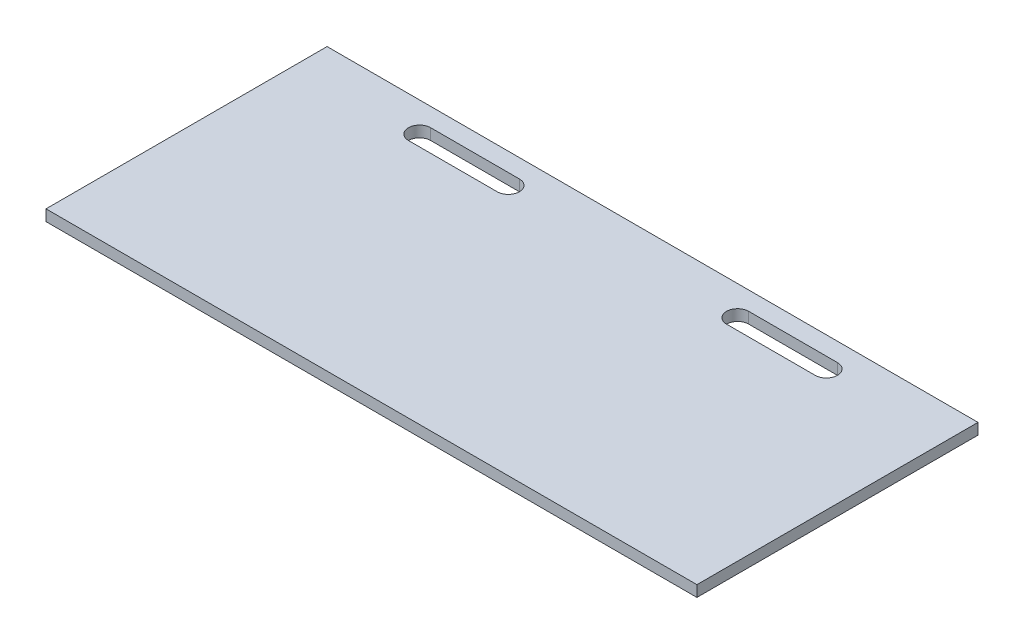
ISO-10303-21;
HEADER;
FILE_DESCRIPTION(('STEP AP214'),'2;1');
FILE_NAME('part.step','',(''),(''),'','','');
FILE_SCHEMA(('AUTOMOTIVE_DESIGN { 1 0 10303 214 1 1 1 1 }'));
ENDSEC;
DATA;
#1=APPLICATION_CONTEXT('core data for automotive mechanical design processes');
#2=APPLICATION_PROTOCOL_DEFINITION('international standard','automotive_design',2000,#1);
#3=PRODUCT_CONTEXT('',#1,'mechanical');
#4=PRODUCT('Part','Part','',(#3));
#5=PRODUCT_RELATED_PRODUCT_CATEGORY('part','',(#4));
#6=PRODUCT_DEFINITION_FORMATION('','',#4);
#7=PRODUCT_DEFINITION_CONTEXT('part definition',#1,'design');
#8=PRODUCT_DEFINITION('design','',#6,#7);
#9=PRODUCT_DEFINITION_SHAPE('','',#8);
#10=(LENGTH_UNIT() NAMED_UNIT(*) SI_UNIT(.MILLI.,.METRE.));
#11=(NAMED_UNIT(*) PLANE_ANGLE_UNIT() SI_UNIT($,.RADIAN.));
#12=(NAMED_UNIT(*) SI_UNIT($,.STERADIAN.) SOLID_ANGLE_UNIT());
#13=UNCERTAINTY_MEASURE_WITH_UNIT(LENGTH_MEASURE(1.E-05),#10,'distance_accuracy_value','');
#14=(GEOMETRIC_REPRESENTATION_CONTEXT(3) GLOBAL_UNCERTAINTY_ASSIGNED_CONTEXT((#13)) GLOBAL_UNIT_ASSIGNED_CONTEXT((#10,
#11,#12)) REPRESENTATION_CONTEXT('',''));
#15=CARTESIAN_POINT('',(0.,0.,0.));
#16=DIRECTION('',(0.,0.,1.));
#17=DIRECTION('',(1.,0.,0.));
#18=AXIS2_PLACEMENT_3D('',#15,#16,#17);
#19=CARTESIAN_POINT('',(-558.8,9.525,241.3));
#20=DIRECTION('',(-1.,0.,0.));
#21=DIRECTION('',(0.,0.,1.));
#22=AXIS2_PLACEMENT_3D('',#19,#20,#21);
#23=PLANE('',#22);
#24=DIRECTION('',(0.,0.,-1.));
#25=VECTOR('',#24,1.);
#26=CARTESIAN_POINT('',(-558.8,-9.525,241.3));
#27=LINE('',#26,#25);
#28=CARTESIAN_POINT('',(-558.8,-9.525,241.3));
#29=VERTEX_POINT('',#28);
#30=CARTESIAN_POINT('',(-558.8,-9.525,-241.3));
#31=VERTEX_POINT('',#30);
#32=EDGE_CURVE('E187',#29,#31,#27,.T.);
#33=ORIENTED_EDGE('',*,*,#32,.F.);
#34=DIRECTION('',(0.,-1.,0.));
#35=VECTOR('',#34,1.);
#36=CARTESIAN_POINT('',(-558.8,9.525,241.3));
#37=LINE('',#36,#35);
#38=CARTESIAN_POINT('',(-558.8,9.525,241.3));
#39=VERTEX_POINT('',#38);
#40=EDGE_CURVE('E11',#39,#29,#37,.T.);
#41=ORIENTED_EDGE('',*,*,#40,.F.);
#42=DIRECTION('',(0.,0.,-1.));
#43=VECTOR('',#42,1.);
#44=CARTESIAN_POINT('',(-558.8,9.525,241.3));
#45=LINE('',#44,#43);
#46=CARTESIAN_POINT('',(-558.8,9.525,-241.3));
#47=VERTEX_POINT('',#46);
#48=EDGE_CURVE('E234',#39,#47,#45,.T.);
#49=ORIENTED_EDGE('',*,*,#48,.T.);
#50=DIRECTION('',(0.,-1.,0.));
#51=VECTOR('',#50,1.);
#52=CARTESIAN_POINT('',(-558.8,9.525,-241.3));
#53=LINE('',#52,#51);
#54=EDGE_CURVE('E51',#47,#31,#53,.T.);
#55=ORIENTED_EDGE('',*,*,#54,.T.);
#56=EDGE_LOOP('',(#33,#41,#49,#55));
#57=FACE_BOUND('',#56,.T.);
#58=ADVANCED_FACE('F48',(#57),#23,.T.);
#59=CARTESIAN_POINT('',(-558.8,9.525,241.3));
#60=DIRECTION('',(0.,0.,-1.));
#61=DIRECTION('',(-1.,0.,0.));
#62=AXIS2_PLACEMENT_3D('',#59,#60,#61);
#63=PLANE('',#62);
#64=DIRECTION('',(1.,0.,0.));
#65=VECTOR('',#64,1.);
#66=CARTESIAN_POINT('',(-558.8,-9.525,241.3));
#67=LINE('',#66,#65);
#68=CARTESIAN_POINT('',(558.8,-9.525,241.3));
#69=VERTEX_POINT('',#68);
#70=EDGE_CURVE('E239',#29,#69,#67,.T.);
#71=ORIENTED_EDGE('',*,*,#70,.T.);
#72=DIRECTION('',(0.,-1.,0.));
#73=VECTOR('',#72,1.);
#74=CARTESIAN_POINT('',(558.8,9.525,241.3));
#75=LINE('',#74,#73);
#76=CARTESIAN_POINT('',(558.8,9.525,241.3));
#77=VERTEX_POINT('',#76);
#78=EDGE_CURVE('E57',#77,#69,#75,.T.);
#79=ORIENTED_EDGE('',*,*,#78,.F.);
#80=DIRECTION('',(1.,0.,0.));
#81=VECTOR('',#80,1.);
#82=CARTESIAN_POINT('',(-558.8,9.525,241.3));
#83=LINE('',#82,#81);
#84=EDGE_CURVE('E246',#39,#77,#83,.T.);
#85=ORIENTED_EDGE('',*,*,#84,.F.);
#86=ORIENTED_EDGE('',*,*,#40,.T.);
#87=EDGE_LOOP('',(#71,#79,#85,#86));
#88=FACE_BOUND('',#87,.T.);
#89=ADVANCED_FACE('F283',(#88),#63,.F.);
#90=CARTESIAN_POINT('',(558.8,9.525,241.3));
#91=DIRECTION('',(-1.,0.,0.));
#92=DIRECTION('',(0.,0.,1.));
#93=AXIS2_PLACEMENT_3D('',#90,#91,#92);
#94=PLANE('',#93);
#95=DIRECTION('',(0.,0.,-1.));
#96=VECTOR('',#95,1.);
#97=CARTESIAN_POINT('',(558.8,-9.525,241.3));
#98=LINE('',#97,#96);
#99=CARTESIAN_POINT('',(558.8,-9.525,-241.3));
#100=VERTEX_POINT('',#99);
#101=EDGE_CURVE('E256',#69,#100,#98,.T.);
#102=ORIENTED_EDGE('',*,*,#101,.T.);
#103=DIRECTION('',(0.,-1.,0.));
#104=VECTOR('',#103,1.);
#105=CARTESIAN_POINT('',(558.8,9.525,-241.3));
#106=LINE('',#105,#104);
#107=CARTESIAN_POINT('',(558.8,9.525,-241.3));
#108=VERTEX_POINT('',#107);
#109=EDGE_CURVE('E264',#108,#100,#106,.T.);
#110=ORIENTED_EDGE('',*,*,#109,.F.);
#111=DIRECTION('',(0.,0.,-1.));
#112=VECTOR('',#111,1.);
#113=CARTESIAN_POINT('',(558.8,9.525,241.3));
#114=LINE('',#113,#112);
#115=EDGE_CURVE('E243',#77,#108,#114,.T.);
#116=ORIENTED_EDGE('',*,*,#115,.F.);
#117=ORIENTED_EDGE('',*,*,#78,.T.);
#118=EDGE_LOOP('',(#102,#110,#116,#117));
#119=FACE_BOUND('',#118,.T.);
#120=ADVANCED_FACE('F287',(#119),#94,.F.);
#121=CARTESIAN_POINT('',(-558.8,9.525,-241.3));
#122=DIRECTION('',(0.,0.,-1.));
#123=DIRECTION('',(-1.,0.,0.));
#124=AXIS2_PLACEMENT_3D('',#121,#122,#123);
#125=PLANE('',#124);
#126=DIRECTION('',(1.,0.,0.));
#127=VECTOR('',#126,1.);
#128=CARTESIAN_POINT('',(-558.8,-9.525,-241.3));
#129=LINE('',#128,#127);
#130=EDGE_CURVE('E252',#31,#100,#129,.T.);
#131=ORIENTED_EDGE('',*,*,#130,.F.);
#132=ORIENTED_EDGE('',*,*,#54,.F.);
#133=DIRECTION('',(1.,0.,0.));
#134=VECTOR('',#133,1.);
#135=CARTESIAN_POINT('',(-558.8,9.525,-241.3));
#136=LINE('',#135,#134);
#137=EDGE_CURVE('E238',#47,#108,#136,.T.);
#138=ORIENTED_EDGE('',*,*,#137,.T.);
#139=ORIENTED_EDGE('',*,*,#109,.T.);
#140=EDGE_LOOP('',(#131,#132,#138,#139));
#141=FACE_BOUND('',#140,.T.);
#142=ADVANCED_FACE('F276',(#141),#125,.T.);
#143=CARTESIAN_POINT('',(0.,9.525,0.));
#144=DIRECTION('',(0.,-1.,0.));
#145=DIRECTION('',(0.,0.,-1.));
#146=AXIS2_PLACEMENT_3D('',#143,#144,#145);
#147=PLANE('',#146);
#148=DIRECTION('',(1.,0.,0.));
#149=VECTOR('',#148,1.);
#150=CARTESIAN_POINT('',(-349.25,9.525,-209.55));
#151=LINE('',#150,#149);
#152=CARTESIAN_POINT('',(-349.25,9.525,-209.55));
#153=VERTEX_POINT('',#152);
#154=CARTESIAN_POINT('',(-196.85,9.525,-209.55));
#155=VERTEX_POINT('',#154);
#156=EDGE_CURVE('E151',#153,#155,#151,.T.);
#157=ORIENTED_EDGE('',*,*,#156,.T.);
#158=CARTESIAN_POINT('',(-196.85,9.525,-190.5));
#159=DIRECTION('',(0.,-1.,0.));
#160=DIRECTION('',(0.,0.,1.));
#161=AXIS2_PLACEMENT_3D('',#158,#159,#160);
#162=CIRCLE('',#161,19.05);
#163=CARTESIAN_POINT('',(-196.85,9.525,-171.45));
#164=VERTEX_POINT('',#163);
#165=EDGE_CURVE('E142',#155,#164,#162,.T.);
#166=ORIENTED_EDGE('',*,*,#165,.T.);
#167=DIRECTION('',(-1.,0.,0.));
#168=VECTOR('',#167,1.);
#169=CARTESIAN_POINT('',(-349.25,9.525,-171.45));
#170=LINE('',#169,#168);
#171=CARTESIAN_POINT('',(-349.25,9.525,-171.45));
#172=VERTEX_POINT('',#171);
#173=EDGE_CURVE('E154',#164,#172,#170,.T.);
#174=ORIENTED_EDGE('',*,*,#173,.T.);
#175=CARTESIAN_POINT('',(-349.25,9.525,-190.5));
#176=DIRECTION('',(0.,-1.,0.));
#177=DIRECTION('',(0.,0.,1.));
#178=AXIS2_PLACEMENT_3D('',#175,#176,#177);
#179=CIRCLE('',#178,19.05);
#180=EDGE_CURVE('E65',#172,#153,#179,.T.);
#181=ORIENTED_EDGE('',*,*,#180,.T.);
#182=EDGE_LOOP('',(#157,#166,#174,#181));
#183=FACE_BOUND('',#182,.T.);
#184=DIRECTION('',(1.,0.,0.));
#185=VECTOR('',#184,1.);
#186=CARTESIAN_POINT('',(196.85,9.525,-209.55));
#187=LINE('',#186,#185);
#188=CARTESIAN_POINT('',(196.85,9.525,-209.55));
#189=VERTEX_POINT('',#188);
#190=CARTESIAN_POINT('',(349.25,9.525,-209.55));
#191=VERTEX_POINT('',#190);
#192=EDGE_CURVE('E197',#189,#191,#187,.T.);
#193=ORIENTED_EDGE('',*,*,#192,.T.);
#194=CARTESIAN_POINT('',(349.25,9.525,-190.5));
#195=DIRECTION('',(0.,-1.,0.));
#196=DIRECTION('',(0.,0.,1.));
#197=AXIS2_PLACEMENT_3D('',#194,#195,#196);
#198=CIRCLE('',#197,19.05);
#199=CARTESIAN_POINT('',(349.25,9.525,-171.45));
#200=VERTEX_POINT('',#199);
#201=EDGE_CURVE('E212',#191,#200,#198,.T.);
#202=ORIENTED_EDGE('',*,*,#201,.T.);
#203=DIRECTION('',(-1.,0.,0.));
#204=VECTOR('',#203,1.);
#205=CARTESIAN_POINT('',(196.85,9.525,-171.45));
#206=LINE('',#205,#204);
#207=CARTESIAN_POINT('',(196.85,9.525,-171.45));
#208=VERTEX_POINT('',#207);
#209=EDGE_CURVE('E227',#200,#208,#206,.T.);
#210=ORIENTED_EDGE('',*,*,#209,.T.);
#211=CARTESIAN_POINT('',(196.85,9.525,-190.5));
#212=DIRECTION('',(0.,-1.,0.));
#213=DIRECTION('',(0.,0.,-1.));
#214=AXIS2_PLACEMENT_3D('',#211,#212,#213);
#215=CIRCLE('',#214,19.05);
#216=EDGE_CURVE('E73',#208,#189,#215,.T.);
#217=ORIENTED_EDGE('',*,*,#216,.T.);
#218=EDGE_LOOP('',(#193,#202,#210,#217));
#219=FACE_BOUND('',#218,.T.);
#220=ORIENTED_EDGE('',*,*,#48,.F.);
#221=ORIENTED_EDGE('',*,*,#84,.T.);
#222=ORIENTED_EDGE('',*,*,#115,.T.);
#223=ORIENTED_EDGE('',*,*,#137,.F.);
#224=EDGE_LOOP('',(#220,#221,#222,#223));
#225=FACE_BOUND('',#224,.T.);
#226=ADVANCED_FACE('F159',(#183,#219,#225),#147,.F.);
#227=CARTESIAN_POINT('',(0.,-9.525,0.));
#228=DIRECTION('',(0.,-1.,0.));
#229=DIRECTION('',(0.,0.,-1.));
#230=AXIS2_PLACEMENT_3D('',#227,#228,#229);
#231=PLANE('',#230);
#232=CARTESIAN_POINT('',(-196.85,-9.525,-190.5));
#233=DIRECTION('',(0.,-1.,0.));
#234=DIRECTION('',(0.,0.,1.));
#235=AXIS2_PLACEMENT_3D('',#232,#233,#234);
#236=CIRCLE('',#235,19.05);
#237=CARTESIAN_POINT('',(-196.85,-9.525,-209.55));
#238=VERTEX_POINT('',#237);
#239=CARTESIAN_POINT('',(-196.85,-9.525,-171.45));
#240=VERTEX_POINT('',#239);
#241=EDGE_CURVE('E145',#238,#240,#236,.T.);
#242=ORIENTED_EDGE('',*,*,#241,.F.);
#243=DIRECTION('',(1.,0.,0.));
#244=VECTOR('',#243,1.);
#245=CARTESIAN_POINT('',(-349.25,-9.525,-209.55));
#246=LINE('',#245,#244);
#247=CARTESIAN_POINT('',(-349.25,-9.525,-209.55));
#248=VERTEX_POINT('',#247);
#249=EDGE_CURVE('E163',#248,#238,#246,.T.);
#250=ORIENTED_EDGE('',*,*,#249,.F.);
#251=CARTESIAN_POINT('',(-349.25,-9.525,-190.5));
#252=DIRECTION('',(0.,-1.,0.));
#253=DIRECTION('',(0.,0.,1.));
#254=AXIS2_PLACEMENT_3D('',#251,#252,#253);
#255=CIRCLE('',#254,19.05);
#256=CARTESIAN_POINT('',(-349.25,-9.525,-171.45));
#257=VERTEX_POINT('',#256);
#258=EDGE_CURVE('E168',#257,#248,#255,.T.);
#259=ORIENTED_EDGE('',*,*,#258,.F.);
#260=DIRECTION('',(-1.,0.,0.));
#261=VECTOR('',#260,1.);
#262=CARTESIAN_POINT('',(-349.25,-9.525,-171.45));
#263=LINE('',#262,#261);
#264=EDGE_CURVE('E177',#240,#257,#263,.T.);
#265=ORIENTED_EDGE('',*,*,#264,.F.);
#266=EDGE_LOOP('',(#242,#250,#259,#265));
#267=FACE_BOUND('',#266,.T.);
#268=CARTESIAN_POINT('',(349.25,-9.525,-190.5));
#269=DIRECTION('',(0.,-1.,0.));
#270=DIRECTION('',(0.,0.,1.));
#271=AXIS2_PLACEMENT_3D('',#268,#269,#270);
#272=CIRCLE('',#271,19.05);
#273=CARTESIAN_POINT('',(349.25,-9.525,-209.55));
#274=VERTEX_POINT('',#273);
#275=CARTESIAN_POINT('',(349.25,-9.525,-171.45));
#276=VERTEX_POINT('',#275);
#277=EDGE_CURVE('E178',#274,#276,#272,.T.);
#278=ORIENTED_EDGE('',*,*,#277,.F.);
#279=DIRECTION('',(1.,0.,0.));
#280=VECTOR('',#279,1.);
#281=CARTESIAN_POINT('',(196.85,-9.525,-209.55));
#282=LINE('',#281,#280);
#283=CARTESIAN_POINT('',(196.85,-9.525,-209.55));
#284=VERTEX_POINT('',#283);
#285=EDGE_CURVE('E207',#284,#274,#282,.T.);
#286=ORIENTED_EDGE('',*,*,#285,.F.);
#287=CARTESIAN_POINT('',(196.85,-9.525,-190.5));
#288=DIRECTION('',(0.,-1.,0.));
#289=DIRECTION('',(0.,0.,-1.));
#290=AXIS2_PLACEMENT_3D('',#287,#288,#289);
#291=CIRCLE('',#290,19.05);
#292=CARTESIAN_POINT('',(196.85,-9.525,-171.45));
#293=VERTEX_POINT('',#292);
#294=EDGE_CURVE('E211',#293,#284,#291,.T.);
#295=ORIENTED_EDGE('',*,*,#294,.F.);
#296=DIRECTION('',(-1.,0.,0.));
#297=VECTOR('',#296,1.);
#298=CARTESIAN_POINT('',(196.85,-9.525,-171.45));
#299=LINE('',#298,#297);
#300=EDGE_CURVE('E216',#276,#293,#299,.T.);
#301=ORIENTED_EDGE('',*,*,#300,.F.);
#302=EDGE_LOOP('',(#278,#286,#295,#301));
#303=FACE_BOUND('',#302,.T.);
#304=ORIENTED_EDGE('',*,*,#32,.T.);
#305=ORIENTED_EDGE('',*,*,#130,.T.);
#306=ORIENTED_EDGE('',*,*,#101,.F.);
#307=ORIENTED_EDGE('',*,*,#70,.F.);
#308=EDGE_LOOP('',(#304,#305,#306,#307));
#309=FACE_BOUND('',#308,.T.);
#310=ADVANCED_FACE('F280',(#267,#303,#309),#231,.T.);
#311=CARTESIAN_POINT('',(349.25,9.525,-190.5));
#312=DIRECTION('',(0.,-1.,0.));
#313=DIRECTION('',(0.,0.,-1.));
#314=AXIS2_PLACEMENT_3D('',#311,#312,#313);
#315=CYLINDRICAL_SURFACE('',#314,19.05);
#316=ORIENTED_EDGE('',*,*,#277,.T.);
#317=DIRECTION('',(0.,-1.,0.));
#318=VECTOR('',#317,1.);
#319=CARTESIAN_POINT('',(349.25,9.525,-171.45));
#320=LINE('',#319,#318);
#321=EDGE_CURVE('E193',#200,#276,#320,.T.);
#322=ORIENTED_EDGE('',*,*,#321,.F.);
#323=ORIENTED_EDGE('',*,*,#201,.F.);
#324=DIRECTION('',(0.,-1.,0.));
#325=VECTOR('',#324,1.);
#326=CARTESIAN_POINT('',(349.25,9.525,-209.55));
#327=LINE('',#326,#325);
#328=EDGE_CURVE('E204',#191,#274,#327,.T.);
#329=ORIENTED_EDGE('',*,*,#328,.T.);
#330=EDGE_LOOP('',(#316,#322,#323,#329));
#331=FACE_BOUND('',#330,.T.);
#332=ADVANCED_FACE('F295',(#331),#315,.F.);
#333=CARTESIAN_POINT('',(196.85,9.525,-209.55));
#334=DIRECTION('',(0.,0.,-1.));
#335=DIRECTION('',(-1.,0.,0.));
#336=AXIS2_PLACEMENT_3D('',#333,#334,#335);
#337=PLANE('',#336);
#338=ORIENTED_EDGE('',*,*,#285,.T.);
#339=ORIENTED_EDGE('',*,*,#328,.F.);
#340=ORIENTED_EDGE('',*,*,#192,.F.);
#341=DIRECTION('',(0.,-1.,0.));
#342=VECTOR('',#341,1.);
#343=CARTESIAN_POINT('',(196.85,9.525,-209.55));
#344=LINE('',#343,#342);
#345=EDGE_CURVE('E201',#189,#284,#344,.T.);
#346=ORIENTED_EDGE('',*,*,#345,.T.);
#347=EDGE_LOOP('',(#338,#339,#340,#346));
#348=FACE_BOUND('',#347,.T.);
#349=ADVANCED_FACE('F335',(#348),#337,.F.);
#350=CARTESIAN_POINT('',(196.85,9.525,-190.5));
#351=DIRECTION('',(0.,-1.,0.));
#352=DIRECTION('',(0.,0.,-1.));
#353=AXIS2_PLACEMENT_3D('',#350,#351,#352);
#354=CYLINDRICAL_SURFACE('',#353,19.05);
#355=ORIENTED_EDGE('',*,*,#294,.T.);
#356=ORIENTED_EDGE('',*,*,#345,.F.);
#357=ORIENTED_EDGE('',*,*,#216,.F.);
#358=DIRECTION('',(0.,-1.,0.));
#359=VECTOR('',#358,1.);
#360=CARTESIAN_POINT('',(196.85,9.525,-171.45));
#361=LINE('',#360,#359);
#362=EDGE_CURVE('E198',#208,#293,#361,.T.);
#363=ORIENTED_EDGE('',*,*,#362,.T.);
#364=EDGE_LOOP('',(#355,#356,#357,#363));
#365=FACE_BOUND('',#364,.T.);
#366=ADVANCED_FACE('F345',(#365),#354,.F.);
#367=CARTESIAN_POINT('',(196.85,9.525,-171.45));
#368=DIRECTION('',(0.,0.,1.));
#369=DIRECTION('',(1.,0.,0.));
#370=AXIS2_PLACEMENT_3D('',#367,#368,#369);
#371=PLANE('',#370);
#372=ORIENTED_EDGE('',*,*,#300,.T.);
#373=ORIENTED_EDGE('',*,*,#362,.F.);
#374=ORIENTED_EDGE('',*,*,#209,.F.);
#375=ORIENTED_EDGE('',*,*,#321,.T.);
#376=EDGE_LOOP('',(#372,#373,#374,#375));
#377=FACE_BOUND('',#376,.T.);
#378=ADVANCED_FACE('F354',(#377),#371,.F.);
#379=CARTESIAN_POINT('',(-196.85,9.525,-190.5));
#380=DIRECTION('',(0.,-1.,0.));
#381=DIRECTION('',(0.,0.,-1.));
#382=AXIS2_PLACEMENT_3D('',#379,#380,#381);
#383=CYLINDRICAL_SURFACE('',#382,19.05);
#384=ORIENTED_EDGE('',*,*,#241,.T.);
#385=DIRECTION('',(0.,-1.,0.));
#386=VECTOR('',#385,1.);
#387=CARTESIAN_POINT('',(-196.85,9.525,-171.45));
#388=LINE('',#387,#386);
#389=EDGE_CURVE('E138',#164,#240,#388,.T.);
#390=ORIENTED_EDGE('',*,*,#389,.F.);
#391=ORIENTED_EDGE('',*,*,#165,.F.);
#392=DIRECTION('',(0.,-1.,0.));
#393=VECTOR('',#392,1.);
#394=CARTESIAN_POINT('',(-196.85,9.525,-209.55));
#395=LINE('',#394,#393);
#396=EDGE_CURVE('E184',#155,#238,#395,.T.);
#397=ORIENTED_EDGE('',*,*,#396,.T.);
#398=EDGE_LOOP('',(#384,#390,#391,#397));
#399=FACE_BOUND('',#398,.T.);
#400=ADVANCED_FACE('F140',(#399),#383,.F.);
#401=CARTESIAN_POINT('',(-349.25,9.525,-209.55));
#402=DIRECTION('',(0.,0.,-1.));
#403=DIRECTION('',(-1.,0.,0.));
#404=AXIS2_PLACEMENT_3D('',#401,#402,#403);
#405=PLANE('',#404);
#406=ORIENTED_EDGE('',*,*,#249,.T.);
#407=ORIENTED_EDGE('',*,*,#396,.F.);
#408=ORIENTED_EDGE('',*,*,#156,.F.);
#409=DIRECTION('',(0.,-1.,0.));
#410=VECTOR('',#409,1.);
#411=CARTESIAN_POINT('',(-349.25,9.525,-209.55));
#412=LINE('',#411,#410);
#413=EDGE_CURVE('E188',#153,#248,#412,.T.);
#414=ORIENTED_EDGE('',*,*,#413,.T.);
#415=EDGE_LOOP('',(#406,#407,#408,#414));
#416=FACE_BOUND('',#415,.T.);
#417=ADVANCED_FACE('F372',(#416),#405,.F.);
#418=CARTESIAN_POINT('',(-349.25,9.525,-190.5));
#419=DIRECTION('',(0.,-1.,0.));
#420=DIRECTION('',(0.,0.,-1.));
#421=AXIS2_PLACEMENT_3D('',#418,#419,#420);
#422=CYLINDRICAL_SURFACE('',#421,19.05);
#423=ORIENTED_EDGE('',*,*,#258,.T.);
#424=ORIENTED_EDGE('',*,*,#413,.F.);
#425=ORIENTED_EDGE('',*,*,#180,.F.);
#426=DIRECTION('',(0.,-1.,0.));
#427=VECTOR('',#426,1.);
#428=CARTESIAN_POINT('',(-349.25,9.525,-171.45));
#429=LINE('',#428,#427);
#430=EDGE_CURVE('E150',#172,#257,#429,.T.);
#431=ORIENTED_EDGE('',*,*,#430,.T.);
#432=EDGE_LOOP('',(#423,#424,#425,#431));
#433=FACE_BOUND('',#432,.T.);
#434=ADVANCED_FACE('F381',(#433),#422,.F.);
#435=CARTESIAN_POINT('',(-349.25,9.525,-171.45));
#436=DIRECTION('',(0.,0.,1.));
#437=DIRECTION('',(1.,0.,0.));
#438=AXIS2_PLACEMENT_3D('',#435,#436,#437);
#439=PLANE('',#438);
#440=ORIENTED_EDGE('',*,*,#264,.T.);
#441=ORIENTED_EDGE('',*,*,#430,.F.);
#442=ORIENTED_EDGE('',*,*,#173,.F.);
#443=ORIENTED_EDGE('',*,*,#389,.T.);
#444=EDGE_LOOP('',(#440,#441,#442,#443));
#445=FACE_BOUND('',#444,.T.);
#446=ADVANCED_FACE('F155',(#445),#439,.F.);
#447=CLOSED_SHELL('',(#58,#89,#120,#142,#226,#310,#332,#349,#366,#378,#400,#417,#434,#446));
#448=MANIFOLD_SOLID_BREP('B2',#447);
#449=ADVANCED_BREP_SHAPE_REPRESENTATION('',(#18,#448),#14);
#450=SHAPE_DEFINITION_REPRESENTATION(#9,#449);
ENDSEC;
END-ISO-10303-21;
